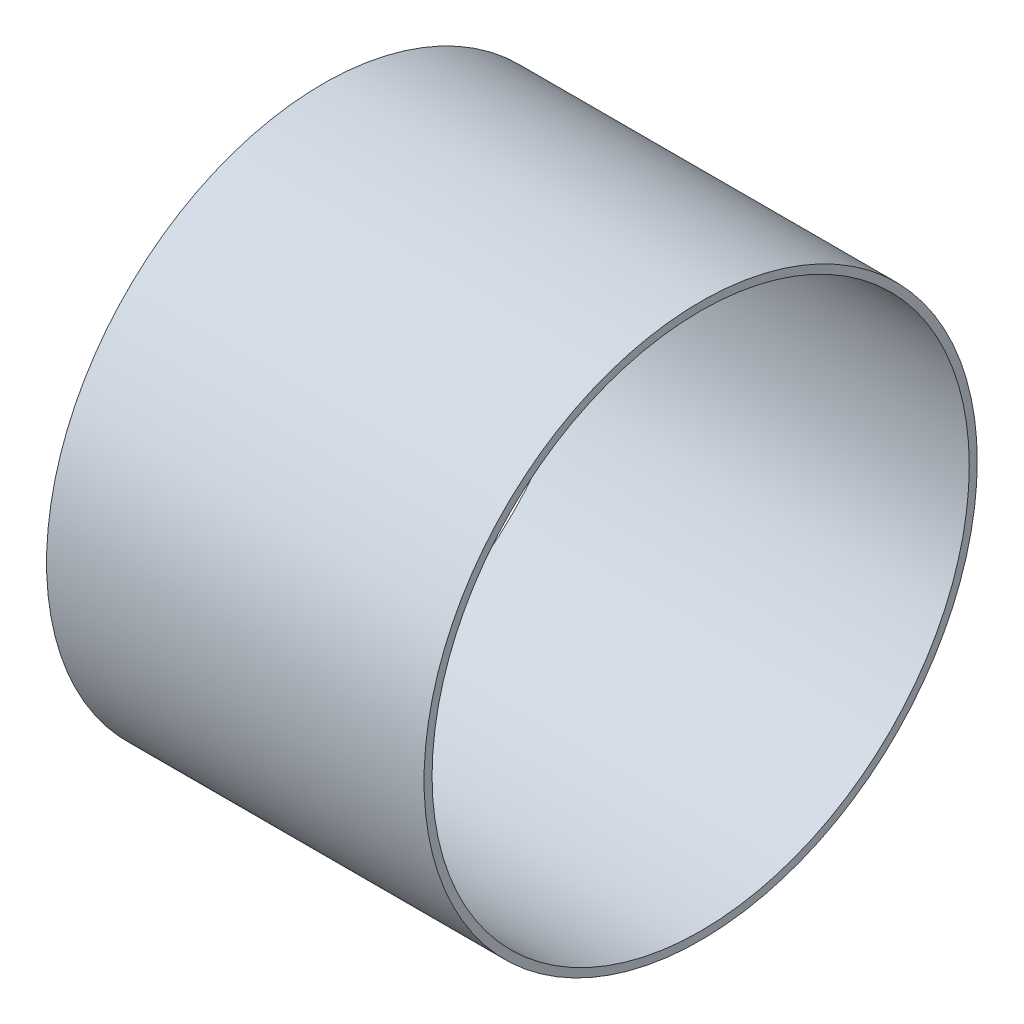
ISO-10303-21;
HEADER;
FILE_DESCRIPTION(('STEP AP214'),'2;1');
FILE_NAME('part.step','',(''),(''),'','','');
FILE_SCHEMA(('AUTOMOTIVE_DESIGN { 1 0 10303 214 1 1 1 1 }'));
ENDSEC;
DATA;
#1=APPLICATION_CONTEXT('core data for automotive mechanical design processes');
#2=APPLICATION_PROTOCOL_DEFINITION('international standard','automotive_design',2000,#1);
#3=PRODUCT_CONTEXT('',#1,'mechanical');
#4=PRODUCT('Part','Part','',(#3));
#5=PRODUCT_RELATED_PRODUCT_CATEGORY('part','',(#4));
#6=PRODUCT_DEFINITION_FORMATION('','',#4);
#7=PRODUCT_DEFINITION_CONTEXT('part definition',#1,'design');
#8=PRODUCT_DEFINITION('design','',#6,#7);
#9=PRODUCT_DEFINITION_SHAPE('','',#8);
#10=(LENGTH_UNIT() NAMED_UNIT(*) SI_UNIT(.MILLI.,.METRE.));
#11=(NAMED_UNIT(*) PLANE_ANGLE_UNIT() SI_UNIT($,.RADIAN.));
#12=(NAMED_UNIT(*) SI_UNIT($,.STERADIAN.) SOLID_ANGLE_UNIT());
#13=UNCERTAINTY_MEASURE_WITH_UNIT(LENGTH_MEASURE(1.E-05),#10,'distance_accuracy_value','');
#14=(GEOMETRIC_REPRESENTATION_CONTEXT(3) GLOBAL_UNCERTAINTY_ASSIGNED_CONTEXT((#13)) GLOBAL_UNIT_ASSIGNED_CONTEXT((#10,
#11,#12)) REPRESENTATION_CONTEXT('',''));
#15=CARTESIAN_POINT('',(0.,0.,0.));
#16=DIRECTION('',(0.,0.,1.));
#17=DIRECTION('',(1.,0.,0.));
#18=AXIS2_PLACEMENT_3D('',#15,#16,#17);
#19=CARTESIAN_POINT('',(78.,0.,0.));
#20=DIRECTION('',(1.,0.,0.));
#21=DIRECTION('',(0.,0.,-1.));
#22=AXIS2_PLACEMENT_3D('',#19,#20,#21);
#23=PLANE('',#22);
#24=CARTESIAN_POINT('',(78.,0.,0.));
#25=DIRECTION('',(1.,0.,0.));
#26=DIRECTION('',(0.,0.,-1.));
#27=AXIS2_PLACEMENT_3D('',#24,#25,#26);
#28=CIRCLE('',#27,57.15);
#29=CARTESIAN_POINT('',(78.,0.,-57.15));
#30=VERTEX_POINT('',#29);
#31=EDGE_CURVE('E10',#30,#30,#28,.T.);
#32=ORIENTED_EDGE('',*,*,#31,.T.);
#33=EDGE_LOOP('',(#32));
#34=FACE_BOUND('',#33,.T.);
#35=CARTESIAN_POINT('',(78.,0.,0.));
#36=DIRECTION('',(1.,0.,0.));
#37=DIRECTION('',(0.,0.,-1.));
#38=AXIS2_PLACEMENT_3D('',#35,#36,#37);
#39=CIRCLE('',#38,55.499);
#40=CARTESIAN_POINT('',(78.,0.,-55.499));
#41=VERTEX_POINT('',#40);
#42=EDGE_CURVE('E48',#41,#41,#39,.T.);
#43=ORIENTED_EDGE('',*,*,#42,.F.);
#44=EDGE_LOOP('',(#43));
#45=FACE_BOUND('',#44,.T.);
#46=ADVANCED_FACE('F37',(#34,#45),#23,.T.);
#47=CARTESIAN_POINT('',(0.,0.,0.));
#48=DIRECTION('',(1.,0.,0.));
#49=DIRECTION('',(0.,0.,-1.));
#50=AXIS2_PLACEMENT_3D('',#47,#48,#49);
#51=PLANE('',#50);
#52=CARTESIAN_POINT('',(0.,0.,0.));
#53=DIRECTION('',(1.,0.,0.));
#54=DIRECTION('',(0.,0.,-1.));
#55=AXIS2_PLACEMENT_3D('',#52,#53,#54);
#56=CIRCLE('',#55,57.15);
#57=CARTESIAN_POINT('',(0.,0.,-57.15));
#58=VERTEX_POINT('',#57);
#59=EDGE_CURVE('E41',#58,#58,#56,.T.);
#60=ORIENTED_EDGE('',*,*,#59,.F.);
#61=EDGE_LOOP('',(#60));
#62=FACE_BOUND('',#61,.T.);
#63=CARTESIAN_POINT('',(0.,0.,0.));
#64=DIRECTION('',(1.,0.,0.));
#65=DIRECTION('',(0.,0.,-1.));
#66=AXIS2_PLACEMENT_3D('',#63,#64,#65);
#67=CIRCLE('',#66,55.499);
#68=CARTESIAN_POINT('',(0.,0.,-55.499));
#69=VERTEX_POINT('',#68);
#70=EDGE_CURVE('E50',#69,#69,#67,.T.);
#71=ORIENTED_EDGE('',*,*,#70,.T.);
#72=EDGE_LOOP('',(#71));
#73=FACE_BOUND('',#72,.T.);
#74=ADVANCED_FACE('F60',(#62,#73),#51,.F.);
#75=CARTESIAN_POINT('',(78.,0.,0.));
#76=DIRECTION('',(-1.,0.,0.));
#77=DIRECTION('',(0.,0.,1.));
#78=AXIS2_PLACEMENT_3D('',#75,#76,#77);
#79=CYLINDRICAL_SURFACE('',#78,57.15);
#80=ORIENTED_EDGE('',*,*,#31,.F.);
#81=EDGE_LOOP('',(#80));
#82=FACE_BOUND('',#81,.T.);
#83=ORIENTED_EDGE('',*,*,#59,.T.);
#84=EDGE_LOOP('',(#83));
#85=FACE_BOUND('',#84,.T.);
#86=ADVANCED_FACE('F39',(#82,#85),#79,.T.);
#87=CARTESIAN_POINT('',(78.,0.,0.));
#88=DIRECTION('',(-1.,0.,0.));
#89=DIRECTION('',(0.,0.,1.));
#90=AXIS2_PLACEMENT_3D('',#87,#88,#89);
#91=CYLINDRICAL_SURFACE('',#90,55.499);
#92=ORIENTED_EDGE('',*,*,#42,.T.);
#93=EDGE_LOOP('',(#92));
#94=FACE_BOUND('',#93,.T.);
#95=ORIENTED_EDGE('',*,*,#70,.F.);
#96=EDGE_LOOP('',(#95));
#97=FACE_BOUND('',#96,.T.);
#98=ADVANCED_FACE('F56',(#94,#97),#91,.F.);
#99=CLOSED_SHELL('',(#46,#74,#86,#98));
#100=MANIFOLD_SOLID_BREP('B2',#99);
#101=ADVANCED_BREP_SHAPE_REPRESENTATION('',(#18,#100),#14);
#102=SHAPE_DEFINITION_REPRESENTATION(#9,#101);
ENDSEC;
END-ISO-10303-21;
